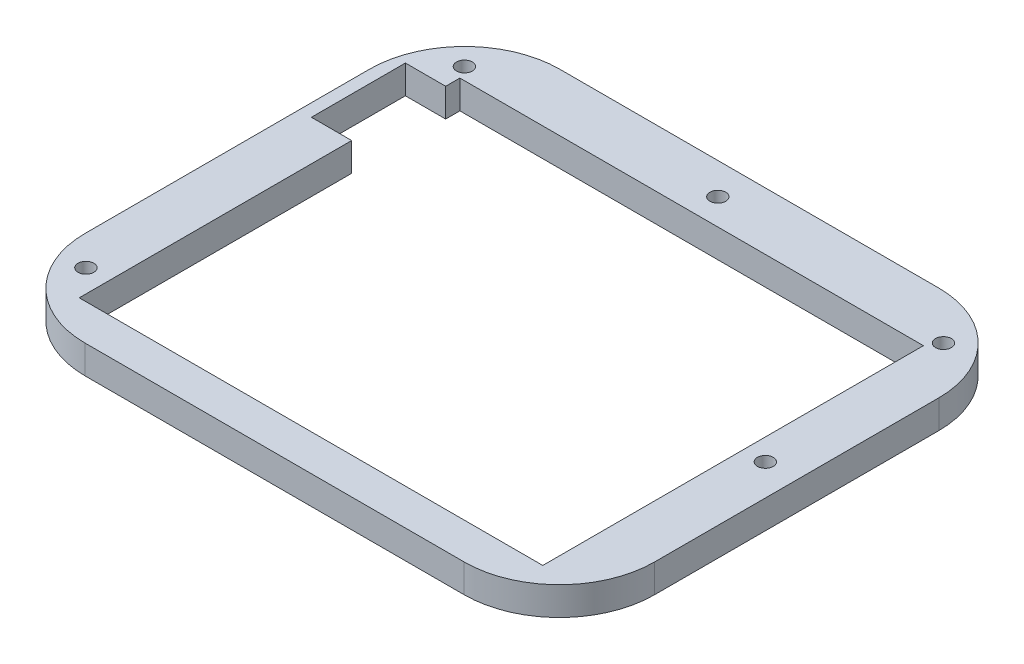
ISO-10303-21;
HEADER;
FILE_DESCRIPTION(('STEP AP214'),'2;1');
FILE_NAME('part.step','',(''),(''),'','','');
FILE_SCHEMA(('AUTOMOTIVE_DESIGN { 1 0 10303 214 1 1 1 1 }'));
ENDSEC;
DATA;
#1=APPLICATION_CONTEXT('core data for automotive mechanical design processes');
#2=APPLICATION_PROTOCOL_DEFINITION('international standard','automotive_design',2000,#1);
#3=PRODUCT_CONTEXT('',#1,'mechanical');
#4=PRODUCT('Part','Part','',(#3));
#5=PRODUCT_RELATED_PRODUCT_CATEGORY('part','',(#4));
#6=PRODUCT_DEFINITION_FORMATION('','',#4);
#7=PRODUCT_DEFINITION_CONTEXT('part definition',#1,'design');
#8=PRODUCT_DEFINITION('design','',#6,#7);
#9=PRODUCT_DEFINITION_SHAPE('','',#8);
#10=(LENGTH_UNIT() NAMED_UNIT(*) SI_UNIT(.MILLI.,.METRE.));
#11=(NAMED_UNIT(*) PLANE_ANGLE_UNIT() SI_UNIT($,.RADIAN.));
#12=(NAMED_UNIT(*) SI_UNIT($,.STERADIAN.) SOLID_ANGLE_UNIT());
#13=UNCERTAINTY_MEASURE_WITH_UNIT(LENGTH_MEASURE(1.E-05),#10,'distance_accuracy_value','');
#14=(GEOMETRIC_REPRESENTATION_CONTEXT(3) GLOBAL_UNCERTAINTY_ASSIGNED_CONTEXT((#13)) GLOBAL_UNIT_ASSIGNED_CONTEXT((#10,
#11,#12)) REPRESENTATION_CONTEXT('',''));
#15=CARTESIAN_POINT('',(0.,0.,0.));
#16=DIRECTION('',(0.,0.,1.));
#17=DIRECTION('',(1.,0.,0.));
#18=AXIS2_PLACEMENT_3D('',#15,#16,#17);
#19=CARTESIAN_POINT('',(-48.92,0.,-38.));
#20=DIRECTION('',(-1.,0.,0.));
#21=DIRECTION('',(0.,0.,1.));
#22=AXIS2_PLACEMENT_3D('',#19,#20,#21);
#23=PLANE('',#22);
#24=DIRECTION('',(0.,0.,1.));
#25=VECTOR('',#24,1.);
#26=CARTESIAN_POINT('',(-48.92,0.,-30.));
#27=LINE('',#26,#25);
#28=CARTESIAN_POINT('',(-48.92,0.,-15.08));
#29=VERTEX_POINT('',#28);
#30=CARTESIAN_POINT('',(-48.92,0.,42.42));
#31=VERTEX_POINT('',#30);
#32=EDGE_CURVE('E143',#29,#31,#27,.T.);
#33=ORIENTED_EDGE('',*,*,#32,.F.);
#34=DIRECTION('',(0.,1.,0.));
#35=VECTOR('',#34,1.);
#36=CARTESIAN_POINT('',(-48.92,0.,-15.08));
#37=LINE('',#36,#35);
#38=CARTESIAN_POINT('',(-48.92,6.,-15.08));
#39=VERTEX_POINT('',#38);
#40=EDGE_CURVE('E166',#29,#39,#37,.T.);
#41=ORIENTED_EDGE('',*,*,#40,.T.);
#42=DIRECTION('',(0.,0.,1.));
#43=VECTOR('',#42,1.);
#44=CARTESIAN_POINT('',(-48.92,6.,-30.));
#45=LINE('',#44,#43);
#46=CARTESIAN_POINT('',(-48.92,6.,42.42));
#47=VERTEX_POINT('',#46);
#48=EDGE_CURVE('E257',#39,#47,#45,.T.);
#49=ORIENTED_EDGE('',*,*,#48,.T.);
#50=DIRECTION('',(0.,1.,0.));
#51=VECTOR('',#50,1.);
#52=CARTESIAN_POINT('',(-48.92,0.,42.42));
#53=LINE('',#52,#51);
#54=EDGE_CURVE('E184',#31,#47,#53,.T.);
#55=ORIENTED_EDGE('',*,*,#54,.F.);
#56=EDGE_LOOP('',(#33,#41,#49,#55));
#57=FACE_BOUND('',#56,.T.);
#58=ADVANCED_FACE('F33',(#57),#23,.F.);
#59=CARTESIAN_POINT('',(-40.,6.,-30.));
#60=DIRECTION('',(0.,-1.,0.));
#61=DIRECTION('',(0.,0.,-1.));
#62=AXIS2_PLACEMENT_3D('',#59,#60,#61);
#63=CYLINDRICAL_SURFACE('',#62,20.08);
#64=CARTESIAN_POINT('',(-40.,0.,-30.));
#65=DIRECTION('',(0.,1.,0.));
#66=DIRECTION('',(0.,0.,1.));
#67=AXIS2_PLACEMENT_3D('',#64,#65,#66);
#68=CIRCLE('',#67,20.08);
#69=CARTESIAN_POINT('',(-40.,0.,-50.08));
#70=VERTEX_POINT('',#69);
#71=CARTESIAN_POINT('',(-60.08,0.,-30.));
#72=VERTEX_POINT('',#71);
#73=EDGE_CURVE('E223',#70,#72,#68,.T.);
#74=ORIENTED_EDGE('',*,*,#73,.T.);
#75=DIRECTION('',(0.,1.,0.));
#76=VECTOR('',#75,1.);
#77=CARTESIAN_POINT('',(-60.08,6.,-30.));
#78=LINE('',#77,#76);
#79=CARTESIAN_POINT('',(-60.08,6.,-30.));
#80=VERTEX_POINT('',#79);
#81=EDGE_CURVE('E12',#80,#72,#78,.F.);
#82=ORIENTED_EDGE('',*,*,#81,.F.);
#83=CARTESIAN_POINT('',(-40.,6.,-30.));
#84=DIRECTION('',(0.,1.,0.));
#85=DIRECTION('',(0.,0.,1.));
#86=AXIS2_PLACEMENT_3D('',#83,#84,#85);
#87=CIRCLE('',#86,20.08);
#88=CARTESIAN_POINT('',(-40.,6.,-50.08));
#89=VERTEX_POINT('',#88);
#90=EDGE_CURVE('E229',#89,#80,#87,.T.);
#91=ORIENTED_EDGE('',*,*,#90,.F.);
#92=DIRECTION('',(0.,-1.,0.));
#93=VECTOR('',#92,1.);
#94=CARTESIAN_POINT('',(-40.,6.,-50.08));
#95=LINE('',#94,#93);
#96=EDGE_CURVE('E203',#89,#70,#95,.T.);
#97=ORIENTED_EDGE('',*,*,#96,.T.);
#98=EDGE_LOOP('',(#74,#82,#91,#97));
#99=FACE_BOUND('',#98,.T.);
#100=ADVANCED_FACE('F303',(#99),#63,.T.);
#101=CARTESIAN_POINT('',(-60.08,6.,-30.));
#102=DIRECTION('',(1.,0.,0.));
#103=DIRECTION('',(0.,0.,-1.));
#104=AXIS2_PLACEMENT_3D('',#101,#102,#103);
#105=PLANE('',#104);
#106=DIRECTION('',(0.,0.,1.));
#107=VECTOR('',#106,1.);
#108=CARTESIAN_POINT('',(-60.08,0.,-30.));
#109=LINE('',#108,#107);
#110=CARTESIAN_POINT('',(-60.08,0.,30.));
#111=VERTEX_POINT('',#110);
#112=EDGE_CURVE('E226',#72,#111,#109,.T.);
#113=ORIENTED_EDGE('',*,*,#112,.T.);
#114=DIRECTION('',(0.,-1.,0.));
#115=VECTOR('',#114,1.);
#116=CARTESIAN_POINT('',(-60.08,6.,30.));
#117=LINE('',#116,#115);
#118=CARTESIAN_POINT('',(-60.08,6.,30.));
#119=VERTEX_POINT('',#118);
#120=EDGE_CURVE('E43',#119,#111,#117,.T.);
#121=ORIENTED_EDGE('',*,*,#120,.F.);
#122=DIRECTION('',(0.,0.,1.));
#123=VECTOR('',#122,1.);
#124=CARTESIAN_POINT('',(-60.08,6.,-30.));
#125=LINE('',#124,#123);
#126=EDGE_CURVE('E242',#80,#119,#125,.T.);
#127=ORIENTED_EDGE('',*,*,#126,.F.);
#128=ORIENTED_EDGE('',*,*,#81,.T.);
#129=EDGE_LOOP('',(#113,#121,#127,#128));
#130=FACE_BOUND('',#129,.T.);
#131=ADVANCED_FACE('F306',(#130),#105,.F.);
#132=CARTESIAN_POINT('',(-40.,6.,30.));
#133=DIRECTION('',(0.,-1.,0.));
#134=DIRECTION('',(0.,0.,-1.));
#135=AXIS2_PLACEMENT_3D('',#132,#133,#134);
#136=CYLINDRICAL_SURFACE('',#135,20.08);
#137=CARTESIAN_POINT('',(-40.,0.,30.));
#138=DIRECTION('',(0.,1.,0.));
#139=DIRECTION('',(0.,0.,1.));
#140=AXIS2_PLACEMENT_3D('',#137,#138,#139);
#141=CIRCLE('',#140,20.08);
#142=CARTESIAN_POINT('',(-40.,0.,50.08));
#143=VERTEX_POINT('',#142);
#144=EDGE_CURVE('E238',#111,#143,#141,.T.);
#145=ORIENTED_EDGE('',*,*,#144,.T.);
#146=DIRECTION('',(0.,1.,0.));
#147=VECTOR('',#146,1.);
#148=CARTESIAN_POINT('',(-40.,6.,50.08));
#149=LINE('',#148,#147);
#150=CARTESIAN_POINT('',(-40.,6.,50.08));
#151=VERTEX_POINT('',#150);
#152=EDGE_CURVE('E209',#151,#143,#149,.F.);
#153=ORIENTED_EDGE('',*,*,#152,.F.);
#154=CARTESIAN_POINT('',(-40.,6.,30.));
#155=DIRECTION('',(0.,1.,0.));
#156=DIRECTION('',(0.,0.,1.));
#157=AXIS2_PLACEMENT_3D('',#154,#155,#156);
#158=CIRCLE('',#157,20.08);
#159=EDGE_CURVE('E244',#119,#151,#158,.T.);
#160=ORIENTED_EDGE('',*,*,#159,.F.);
#161=ORIENTED_EDGE('',*,*,#120,.T.);
#162=EDGE_LOOP('',(#145,#153,#160,#161));
#163=FACE_BOUND('',#162,.T.);
#164=ADVANCED_FACE('F311',(#163),#136,.T.);
#165=CARTESIAN_POINT('',(-40.,6.,50.08));
#166=DIRECTION('',(0.,0.,-1.));
#167=DIRECTION('',(-1.,0.,0.));
#168=AXIS2_PLACEMENT_3D('',#165,#166,#167);
#169=PLANE('',#168);
#170=DIRECTION('',(1.,0.,0.));
#171=VECTOR('',#170,1.);
#172=CARTESIAN_POINT('',(-40.,0.,50.08));
#173=LINE('',#172,#171);
#174=CARTESIAN_POINT('',(40.,0.,50.08));
#175=VERTEX_POINT('',#174);
#176=EDGE_CURVE('E236',#143,#175,#173,.T.);
#177=ORIENTED_EDGE('',*,*,#176,.T.);
#178=DIRECTION('',(0.,-1.,0.));
#179=VECTOR('',#178,1.);
#180=CARTESIAN_POINT('',(40.,6.,50.08));
#181=LINE('',#180,#179);
#182=CARTESIAN_POINT('',(40.,6.,50.08));
#183=VERTEX_POINT('',#182);
#184=EDGE_CURVE('E212',#183,#175,#181,.T.);
#185=ORIENTED_EDGE('',*,*,#184,.F.);
#186=DIRECTION('',(1.,0.,0.));
#187=VECTOR('',#186,1.);
#188=CARTESIAN_POINT('',(-40.,6.,50.08));
#189=LINE('',#188,#187);
#190=EDGE_CURVE('E246',#151,#183,#189,.T.);
#191=ORIENTED_EDGE('',*,*,#190,.F.);
#192=ORIENTED_EDGE('',*,*,#152,.T.);
#193=EDGE_LOOP('',(#177,#185,#191,#192));
#194=FACE_BOUND('',#193,.T.);
#195=ADVANCED_FACE('F317',(#194),#169,.F.);
#196=CARTESIAN_POINT('',(40.,6.,30.));
#197=DIRECTION('',(0.,-1.,0.));
#198=DIRECTION('',(0.,0.,-1.));
#199=AXIS2_PLACEMENT_3D('',#196,#197,#198);
#200=CYLINDRICAL_SURFACE('',#199,20.08);
#201=CARTESIAN_POINT('',(40.,0.,30.));
#202=DIRECTION('',(0.,1.,0.));
#203=DIRECTION('',(0.,0.,1.));
#204=AXIS2_PLACEMENT_3D('',#201,#202,#203);
#205=CIRCLE('',#204,20.08);
#206=CARTESIAN_POINT('',(60.08,0.,30.));
#207=VERTEX_POINT('',#206);
#208=EDGE_CURVE('E234',#175,#207,#205,.T.);
#209=ORIENTED_EDGE('',*,*,#208,.T.);
#210=DIRECTION('',(0.,1.,0.));
#211=VECTOR('',#210,1.);
#212=CARTESIAN_POINT('',(60.08,6.,30.));
#213=LINE('',#212,#211);
#214=CARTESIAN_POINT('',(60.08,6.,30.));
#215=VERTEX_POINT('',#214);
#216=EDGE_CURVE('E215',#215,#207,#213,.F.);
#217=ORIENTED_EDGE('',*,*,#216,.F.);
#218=CARTESIAN_POINT('',(40.,6.,30.));
#219=DIRECTION('',(0.,1.,0.));
#220=DIRECTION('',(0.,0.,1.));
#221=AXIS2_PLACEMENT_3D('',#218,#219,#220);
#222=CIRCLE('',#221,20.08);
#223=EDGE_CURVE('E248',#183,#215,#222,.T.);
#224=ORIENTED_EDGE('',*,*,#223,.F.);
#225=ORIENTED_EDGE('',*,*,#184,.T.);
#226=EDGE_LOOP('',(#209,#217,#224,#225));
#227=FACE_BOUND('',#226,.T.);
#228=ADVANCED_FACE('F321',(#227),#200,.T.);
#229=CARTESIAN_POINT('',(60.08,6.,-30.));
#230=DIRECTION('',(-1.,0.,0.));
#231=DIRECTION('',(0.,0.,1.));
#232=AXIS2_PLACEMENT_3D('',#229,#230,#231);
#233=PLANE('',#232);
#234=DIRECTION('',(0.,0.,-1.));
#235=VECTOR('',#234,1.);
#236=CARTESIAN_POINT('',(60.08,0.,-30.));
#237=LINE('',#236,#235);
#238=CARTESIAN_POINT('',(60.08,0.,-30.));
#239=VERTEX_POINT('',#238);
#240=EDGE_CURVE('E232',#207,#239,#237,.T.);
#241=ORIENTED_EDGE('',*,*,#240,.T.);
#242=DIRECTION('',(0.,-1.,0.));
#243=VECTOR('',#242,1.);
#244=CARTESIAN_POINT('',(60.08,6.,-30.));
#245=LINE('',#244,#243);
#246=CARTESIAN_POINT('',(60.08,6.,-30.));
#247=VERTEX_POINT('',#246);
#248=EDGE_CURVE('E218',#247,#239,#245,.T.);
#249=ORIENTED_EDGE('',*,*,#248,.F.);
#250=DIRECTION('',(0.,0.,-1.));
#251=VECTOR('',#250,1.);
#252=CARTESIAN_POINT('',(60.08,6.,-30.));
#253=LINE('',#252,#251);
#254=EDGE_CURVE('E250',#215,#247,#253,.T.);
#255=ORIENTED_EDGE('',*,*,#254,.F.);
#256=ORIENTED_EDGE('',*,*,#216,.T.);
#257=EDGE_LOOP('',(#241,#249,#255,#256));
#258=FACE_BOUND('',#257,.T.);
#259=ADVANCED_FACE('F326',(#258),#233,.F.);
#260=CARTESIAN_POINT('',(40.,6.,-30.));
#261=DIRECTION('',(0.,-1.,0.));
#262=DIRECTION('',(0.,0.,-1.));
#263=AXIS2_PLACEMENT_3D('',#260,#261,#262);
#264=CYLINDRICAL_SURFACE('',#263,20.08);
#265=CARTESIAN_POINT('',(40.,0.,-30.));
#266=DIRECTION('',(0.,1.,0.));
#267=DIRECTION('',(0.,0.,1.));
#268=AXIS2_PLACEMENT_3D('',#265,#266,#267);
#269=CIRCLE('',#268,20.08);
#270=CARTESIAN_POINT('',(40.,0.,-50.08));
#271=VERTEX_POINT('',#270);
#272=EDGE_CURVE('E230',#239,#271,#269,.T.);
#273=ORIENTED_EDGE('',*,*,#272,.T.);
#274=DIRECTION('',(0.,1.,0.));
#275=VECTOR('',#274,1.);
#276=CARTESIAN_POINT('',(40.,6.,-50.08));
#277=LINE('',#276,#275);
#278=CARTESIAN_POINT('',(40.,6.,-50.08));
#279=VERTEX_POINT('',#278);
#280=EDGE_CURVE('E206',#279,#271,#277,.F.);
#281=ORIENTED_EDGE('',*,*,#280,.F.);
#282=CARTESIAN_POINT('',(40.,6.,-30.));
#283=DIRECTION('',(0.,1.,0.));
#284=DIRECTION('',(0.,0.,1.));
#285=AXIS2_PLACEMENT_3D('',#282,#283,#284);
#286=CIRCLE('',#285,20.08);
#287=EDGE_CURVE('E114',#247,#279,#286,.T.);
#288=ORIENTED_EDGE('',*,*,#287,.F.);
#289=ORIENTED_EDGE('',*,*,#248,.T.);
#290=EDGE_LOOP('',(#273,#281,#288,#289));
#291=FACE_BOUND('',#290,.T.);
#292=ADVANCED_FACE('F329',(#291),#264,.T.);
#293=CARTESIAN_POINT('',(-40.,6.,-50.08));
#294=DIRECTION('',(0.,0.,1.));
#295=DIRECTION('',(1.,0.,0.));
#296=AXIS2_PLACEMENT_3D('',#293,#294,#295);
#297=PLANE('',#296);
#298=DIRECTION('',(-1.,0.,0.));
#299=VECTOR('',#298,1.);
#300=CARTESIAN_POINT('',(-40.,0.,-50.08));
#301=LINE('',#300,#299);
#302=EDGE_CURVE('E227',#271,#70,#301,.T.);
#303=ORIENTED_EDGE('',*,*,#302,.T.);
#304=ORIENTED_EDGE('',*,*,#96,.F.);
#305=DIRECTION('',(-1.,0.,0.));
#306=VECTOR('',#305,1.);
#307=CARTESIAN_POINT('',(-40.,6.,-50.08));
#308=LINE('',#307,#306);
#309=EDGE_CURVE('E118',#279,#89,#308,.T.);
#310=ORIENTED_EDGE('',*,*,#309,.F.);
#311=ORIENTED_EDGE('',*,*,#280,.T.);
#312=EDGE_LOOP('',(#303,#304,#310,#311));
#313=FACE_BOUND('',#312,.T.);
#314=ADVANCED_FACE('F35',(#313),#297,.F.);
#315=CARTESIAN_POINT('',(-40.,6.,-30.));
#316=DIRECTION('',(0.,1.,0.));
#317=DIRECTION('',(0.,0.,1.));
#318=AXIS2_PLACEMENT_3D('',#315,#316,#317);
#319=PLANE('',#318);
#320=DIRECTION('',(1.,0.,0.));
#321=VECTOR('',#320,1.);
#322=CARTESIAN_POINT('',(-40.,6.,-15.08));
#323=LINE('',#322,#321);
#324=CARTESIAN_POINT('',(-57.42,6.,-15.08));
#325=VERTEX_POINT('',#324);
#326=EDGE_CURVE('E172',#325,#39,#323,.T.);
#327=ORIENTED_EDGE('',*,*,#326,.F.);
#328=DIRECTION('',(0.,0.,1.));
#329=VECTOR('',#328,1.);
#330=CARTESIAN_POINT('',(-57.42,6.,-30.));
#331=LINE('',#330,#329);
#332=CARTESIAN_POINT('',(-57.42,6.,-34.92));
#333=VERTEX_POINT('',#332);
#334=EDGE_CURVE('E493',#333,#325,#331,.T.);
#335=ORIENTED_EDGE('',*,*,#334,.F.);
#336=DIRECTION('',(-1.,0.,0.));
#337=VECTOR('',#336,1.);
#338=CARTESIAN_POINT('',(-40.,6.,-34.92));
#339=LINE('',#338,#337);
#340=CARTESIAN_POINT('',(-48.92,6.,-34.92));
#341=VERTEX_POINT('',#340);
#342=EDGE_CURVE('E488',#341,#333,#339,.T.);
#343=ORIENTED_EDGE('',*,*,#342,.F.);
#344=DIRECTION('',(0.,0.,1.));
#345=VECTOR('',#344,1.);
#346=CARTESIAN_POINT('',(-48.92,6.,-30.));
#347=LINE('',#346,#345);
#348=CARTESIAN_POINT('',(-48.92,6.,-37.92));
#349=VERTEX_POINT('',#348);
#350=EDGE_CURVE('E500',#349,#341,#347,.T.);
#351=ORIENTED_EDGE('',*,*,#350,.F.);
#352=DIRECTION('',(-1.,0.,0.));
#353=VECTOR('',#352,1.);
#354=CARTESIAN_POINT('',(-40.,6.,-37.92));
#355=LINE('',#354,#353);
#356=CARTESIAN_POINT('',(48.92,6.,-37.92));
#357=VERTEX_POINT('',#356);
#358=EDGE_CURVE('E187',#357,#349,#355,.T.);
#359=ORIENTED_EDGE('',*,*,#358,.F.);
#360=DIRECTION('',(0.,0.,-1.));
#361=VECTOR('',#360,1.);
#362=CARTESIAN_POINT('',(48.92,6.,-30.));
#363=LINE('',#362,#361);
#364=CARTESIAN_POINT('',(48.92,6.,42.42));
#365=VERTEX_POINT('',#364);
#366=EDGE_CURVE('E192',#365,#357,#363,.T.);
#367=ORIENTED_EDGE('',*,*,#366,.F.);
#368=DIRECTION('',(1.,0.,0.));
#369=VECTOR('',#368,1.);
#370=CARTESIAN_POINT('',(-40.,6.,42.42));
#371=LINE('',#370,#369);
#372=EDGE_CURVE('E501',#47,#365,#371,.T.);
#373=ORIENTED_EDGE('',*,*,#372,.F.);
#374=ORIENTED_EDGE('',*,*,#48,.F.);
#375=EDGE_LOOP('',(#327,#335,#343,#351,#359,#367,#373,#374));
#376=FACE_BOUND('',#375,.T.);
#377=CARTESIAN_POINT('',(-53.7092926056019,6.,36.2273752960605));
#378=DIRECTION('',(0.,1.,0.));
#379=DIRECTION('',(0.,0.,1.));
#380=AXIS2_PLACEMENT_3D('',#377,#378,#379);
#381=CIRCLE('',#380,1.67000000000001);
#382=CARTESIAN_POINT('',(-53.7092926056019,6.,37.8973752960605));
#383=VERTEX_POINT('',#382);
#384=EDGE_CURVE('E37',#383,#383,#381,.T.);
#385=ORIENTED_EDGE('',*,*,#384,.F.);
#386=EDGE_LOOP('',(#385));
#387=FACE_BOUND('',#386,.T.);
#388=CARTESIAN_POINT('',(-50.5585567633134,6.,-40.5085567633135));
#389=DIRECTION('',(0.,1.,0.));
#390=DIRECTION('',(0.,0.,1.));
#391=AXIS2_PLACEMENT_3D('',#388,#389,#390);
#392=CIRCLE('',#391,1.67000000000002);
#393=CARTESIAN_POINT('',(-50.5585567633134,6.,-38.8385567633135));
#394=VERTEX_POINT('',#393);
#395=EDGE_CURVE('E276',#394,#394,#392,.T.);
#396=ORIENTED_EDGE('',*,*,#395,.F.);
#397=EDGE_LOOP('',(#396));
#398=FACE_BOUND('',#397,.T.);
#399=CARTESIAN_POINT('',(50.5585567633134,6.,-40.5085567633134));
#400=DIRECTION('',(0.,1.,0.));
#401=DIRECTION('',(0.,0.,1.));
#402=AXIS2_PLACEMENT_3D('',#399,#400,#401);
#403=CIRCLE('',#402,1.67);
#404=CARTESIAN_POINT('',(50.5585567633134,6.,-38.8385567633134));
#405=VERTEX_POINT('',#404);
#406=EDGE_CURVE('E270',#405,#405,#403,.T.);
#407=ORIENTED_EDGE('',*,*,#406,.F.);
#408=EDGE_LOOP('',(#407));
#409=FACE_BOUND('',#408,.T.);
#410=CARTESIAN_POINT('',(0.,6.,-43.45));
#411=DIRECTION('',(0.,1.,0.));
#412=DIRECTION('',(0.,0.,1.));
#413=AXIS2_PLACEMENT_3D('',#410,#411,#412);
#414=CIRCLE('',#413,1.67);
#415=CARTESIAN_POINT('',(0.,6.,-41.78));
#416=VERTEX_POINT('',#415);
#417=EDGE_CURVE('E264',#416,#416,#414,.T.);
#418=ORIENTED_EDGE('',*,*,#417,.F.);
#419=EDGE_LOOP('',(#418));
#420=FACE_BOUND('',#419,.T.);
#421=CARTESIAN_POINT('',(53.475,6.,0.));
#422=DIRECTION('',(0.,1.,0.));
#423=DIRECTION('',(0.,0.,1.));
#424=AXIS2_PLACEMENT_3D('',#421,#422,#423);
#425=CIRCLE('',#424,1.67000000000001);
#426=CARTESIAN_POINT('',(53.475,6.,1.67000000000001));
#427=VERTEX_POINT('',#426);
#428=EDGE_CURVE('E258',#427,#427,#425,.T.);
#429=ORIENTED_EDGE('',*,*,#428,.F.);
#430=EDGE_LOOP('',(#429));
#431=FACE_BOUND('',#430,.T.);
#432=ORIENTED_EDGE('',*,*,#90,.T.);
#433=ORIENTED_EDGE('',*,*,#126,.T.);
#434=ORIENTED_EDGE('',*,*,#159,.T.);
#435=ORIENTED_EDGE('',*,*,#190,.T.);
#436=ORIENTED_EDGE('',*,*,#223,.T.);
#437=ORIENTED_EDGE('',*,*,#254,.T.);
#438=ORIENTED_EDGE('',*,*,#287,.T.);
#439=ORIENTED_EDGE('',*,*,#309,.T.);
#440=EDGE_LOOP('',(#432,#433,#434,#435,#436,#437,#438,#439));
#441=FACE_BOUND('',#440,.T.);
#442=ADVANCED_FACE('F287',(#376,#387,#398,#409,#420,#431,#441),#319,.T.);
#443=CARTESIAN_POINT('',(-40.,0.,-30.));
#444=DIRECTION('',(0.,1.,0.));
#445=DIRECTION('',(0.,0.,1.));
#446=AXIS2_PLACEMENT_3D('',#443,#444,#445);
#447=PLANE('',#446);
#448=CARTESIAN_POINT('',(-53.7092926056019,0.,36.2273752960605));
#449=DIRECTION('',(0.,1.,0.));
#450=DIRECTION('',(0.,0.,1.));
#451=AXIS2_PLACEMENT_3D('',#448,#449,#450);
#452=CIRCLE('',#451,1.67000000000001);
#453=CARTESIAN_POINT('',(-53.7092926056019,0.,37.8973752960605));
#454=VERTEX_POINT('',#453);
#455=EDGE_CURVE('E278',#454,#454,#452,.T.);
#456=ORIENTED_EDGE('',*,*,#455,.T.);
#457=EDGE_LOOP('',(#456));
#458=FACE_BOUND('',#457,.T.);
#459=CARTESIAN_POINT('',(-50.5585567633134,0.,-40.5085567633135));
#460=DIRECTION('',(0.,1.,0.));
#461=DIRECTION('',(0.,0.,1.));
#462=AXIS2_PLACEMENT_3D('',#459,#460,#461);
#463=CIRCLE('',#462,1.67000000000002);
#464=CARTESIAN_POINT('',(-50.5585567633134,0.,-38.8385567633135));
#465=VERTEX_POINT('',#464);
#466=EDGE_CURVE('E273',#465,#465,#463,.T.);
#467=ORIENTED_EDGE('',*,*,#466,.T.);
#468=EDGE_LOOP('',(#467));
#469=FACE_BOUND('',#468,.T.);
#470=CARTESIAN_POINT('',(50.5585567633134,0.,-40.5085567633134));
#471=DIRECTION('',(0.,1.,0.));
#472=DIRECTION('',(0.,0.,1.));
#473=AXIS2_PLACEMENT_3D('',#470,#471,#472);
#474=CIRCLE('',#473,1.67);
#475=CARTESIAN_POINT('',(50.5585567633134,0.,-38.8385567633134));
#476=VERTEX_POINT('',#475);
#477=EDGE_CURVE('E267',#476,#476,#474,.T.);
#478=ORIENTED_EDGE('',*,*,#477,.T.);
#479=EDGE_LOOP('',(#478));
#480=FACE_BOUND('',#479,.T.);
#481=CARTESIAN_POINT('',(0.,0.,-43.45));
#482=DIRECTION('',(0.,1.,0.));
#483=DIRECTION('',(0.,0.,1.));
#484=AXIS2_PLACEMENT_3D('',#481,#482,#483);
#485=CIRCLE('',#484,1.67);
#486=CARTESIAN_POINT('',(0.,0.,-41.78));
#487=VERTEX_POINT('',#486);
#488=EDGE_CURVE('E261',#487,#487,#485,.T.);
#489=ORIENTED_EDGE('',*,*,#488,.T.);
#490=EDGE_LOOP('',(#489));
#491=FACE_BOUND('',#490,.T.);
#492=CARTESIAN_POINT('',(53.475,0.,0.));
#493=DIRECTION('',(0.,1.,0.));
#494=DIRECTION('',(0.,0.,1.));
#495=AXIS2_PLACEMENT_3D('',#492,#493,#494);
#496=CIRCLE('',#495,1.67000000000001);
#497=CARTESIAN_POINT('',(53.475,0.,1.67000000000001));
#498=VERTEX_POINT('',#497);
#499=EDGE_CURVE('E254',#498,#498,#496,.T.);
#500=ORIENTED_EDGE('',*,*,#499,.T.);
#501=EDGE_LOOP('',(#500));
#502=FACE_BOUND('',#501,.T.);
#503=DIRECTION('',(0.,0.,1.));
#504=VECTOR('',#503,1.);
#505=CARTESIAN_POINT('',(-57.42,0.,-30.));
#506=LINE('',#505,#504);
#507=CARTESIAN_POINT('',(-57.42,0.,-34.92));
#508=VERTEX_POINT('',#507);
#509=CARTESIAN_POINT('',(-57.42,0.,-15.08));
#510=VERTEX_POINT('',#509);
#511=EDGE_CURVE('E180',#508,#510,#506,.T.);
#512=ORIENTED_EDGE('',*,*,#511,.T.);
#513=DIRECTION('',(1.,0.,0.));
#514=VECTOR('',#513,1.);
#515=CARTESIAN_POINT('',(-40.,0.,-15.08));
#516=LINE('',#515,#514);
#517=EDGE_CURVE('E169',#510,#29,#516,.T.);
#518=ORIENTED_EDGE('',*,*,#517,.T.);
#519=ORIENTED_EDGE('',*,*,#32,.T.);
#520=DIRECTION('',(1.,0.,0.));
#521=VECTOR('',#520,1.);
#522=CARTESIAN_POINT('',(-40.,0.,42.42));
#523=LINE('',#522,#521);
#524=CARTESIAN_POINT('',(48.92,0.,42.42));
#525=VERTEX_POINT('',#524);
#526=EDGE_CURVE('E190',#31,#525,#523,.T.);
#527=ORIENTED_EDGE('',*,*,#526,.T.);
#528=DIRECTION('',(0.,0.,-1.));
#529=VECTOR('',#528,1.);
#530=CARTESIAN_POINT('',(48.92,0.,-30.));
#531=LINE('',#530,#529);
#532=CARTESIAN_POINT('',(48.92,0.,-37.92));
#533=VERTEX_POINT('',#532);
#534=EDGE_CURVE('E126',#525,#533,#531,.T.);
#535=ORIENTED_EDGE('',*,*,#534,.T.);
#536=DIRECTION('',(-1.,0.,0.));
#537=VECTOR('',#536,1.);
#538=CARTESIAN_POINT('',(-40.,0.,-37.92));
#539=LINE('',#538,#537);
#540=CARTESIAN_POINT('',(-48.92,0.,-37.92));
#541=VERTEX_POINT('',#540);
#542=EDGE_CURVE('E198',#533,#541,#539,.T.);
#543=ORIENTED_EDGE('',*,*,#542,.T.);
#544=DIRECTION('',(0.,0.,1.));
#545=VECTOR('',#544,1.);
#546=CARTESIAN_POINT('',(-48.92,0.,-30.));
#547=LINE('',#546,#545);
#548=CARTESIAN_POINT('',(-48.92,0.,-34.92));
#549=VERTEX_POINT('',#548);
#550=EDGE_CURVE('E186',#541,#549,#547,.T.);
#551=ORIENTED_EDGE('',*,*,#550,.T.);
#552=DIRECTION('',(-1.,0.,0.));
#553=VECTOR('',#552,1.);
#554=CARTESIAN_POINT('',(-40.,0.,-34.92));
#555=LINE('',#554,#553);
#556=EDGE_CURVE('E52',#549,#508,#555,.T.);
#557=ORIENTED_EDGE('',*,*,#556,.T.);
#558=EDGE_LOOP('',(#512,#518,#519,#527,#535,#543,#551,#557));
#559=FACE_BOUND('',#558,.T.);
#560=ORIENTED_EDGE('',*,*,#73,.F.);
#561=ORIENTED_EDGE('',*,*,#302,.F.);
#562=ORIENTED_EDGE('',*,*,#272,.F.);
#563=ORIENTED_EDGE('',*,*,#240,.F.);
#564=ORIENTED_EDGE('',*,*,#208,.F.);
#565=ORIENTED_EDGE('',*,*,#176,.F.);
#566=ORIENTED_EDGE('',*,*,#144,.F.);
#567=ORIENTED_EDGE('',*,*,#112,.F.);
#568=EDGE_LOOP('',(#560,#561,#562,#563,#564,#565,#566,#567));
#569=FACE_BOUND('',#568,.T.);
#570=ADVANCED_FACE('F177',(#458,#469,#480,#491,#502,#559,#569),#447,.F.);
#571=ORIENTED_EDGE('',*,*,#350,.T.);
#572=DIRECTION('',(0.,1.,0.));
#573=VECTOR('',#572,1.);
#574=CARTESIAN_POINT('',(-48.92,0.,-34.92));
#575=LINE('',#574,#573);
#576=EDGE_CURVE('E181',#549,#341,#575,.T.);
#577=ORIENTED_EDGE('',*,*,#576,.F.);
#578=ORIENTED_EDGE('',*,*,#550,.F.);
#579=DIRECTION('',(0.,1.,0.));
#580=VECTOR('',#579,1.);
#581=CARTESIAN_POINT('',(-48.92,0.,-37.92));
#582=LINE('',#581,#580);
#583=EDGE_CURVE('E151',#541,#349,#582,.T.);
#584=ORIENTED_EDGE('',*,*,#583,.T.);
#585=EDGE_LOOP('',(#571,#577,#578,#584));
#586=FACE_BOUND('',#585,.T.);
#587=ADVANCED_FACE('F333',(#586),#23,.F.);
#588=CARTESIAN_POINT('',(-49.,0.,-37.92));
#589=DIRECTION('',(0.,0.,-1.));
#590=DIRECTION('',(-1.,0.,0.));
#591=AXIS2_PLACEMENT_3D('',#588,#589,#590);
#592=PLANE('',#591);
#593=ORIENTED_EDGE('',*,*,#358,.T.);
#594=ORIENTED_EDGE('',*,*,#583,.F.);
#595=ORIENTED_EDGE('',*,*,#542,.F.);
#596=DIRECTION('',(0.,1.,0.));
#597=VECTOR('',#596,1.);
#598=CARTESIAN_POINT('',(48.92,0.,-37.92));
#599=LINE('',#598,#597);
#600=EDGE_CURVE('E134',#533,#357,#599,.T.);
#601=ORIENTED_EDGE('',*,*,#600,.T.);
#602=EDGE_LOOP('',(#593,#594,#595,#601));
#603=FACE_BOUND('',#602,.T.);
#604=ADVANCED_FACE('F338',(#603),#592,.F.);
#605=CARTESIAN_POINT('',(48.92,0.,-38.));
#606=DIRECTION('',(1.,0.,0.));
#607=DIRECTION('',(0.,0.,-1.));
#608=AXIS2_PLACEMENT_3D('',#605,#606,#607);
#609=PLANE('',#608);
#610=ORIENTED_EDGE('',*,*,#366,.T.);
#611=ORIENTED_EDGE('',*,*,#600,.F.);
#612=ORIENTED_EDGE('',*,*,#534,.F.);
#613=DIRECTION('',(0.,1.,0.));
#614=VECTOR('',#613,1.);
#615=CARTESIAN_POINT('',(48.92,0.,42.42));
#616=LINE('',#615,#614);
#617=EDGE_CURVE('E507',#525,#365,#616,.T.);
#618=ORIENTED_EDGE('',*,*,#617,.T.);
#619=EDGE_LOOP('',(#610,#611,#612,#618));
#620=FACE_BOUND('',#619,.T.);
#621=ADVANCED_FACE('F353',(#620),#609,.F.);
#622=CARTESIAN_POINT('',(-49.,0.,42.42));
#623=DIRECTION('',(0.,0.,1.));
#624=DIRECTION('',(1.,0.,0.));
#625=AXIS2_PLACEMENT_3D('',#622,#623,#624);
#626=PLANE('',#625);
#627=ORIENTED_EDGE('',*,*,#372,.T.);
#628=ORIENTED_EDGE('',*,*,#617,.F.);
#629=ORIENTED_EDGE('',*,*,#526,.F.);
#630=ORIENTED_EDGE('',*,*,#54,.T.);
#631=EDGE_LOOP('',(#627,#628,#629,#630));
#632=FACE_BOUND('',#631,.T.);
#633=ADVANCED_FACE('F357',(#632),#626,.F.);
#634=CARTESIAN_POINT('',(53.475,0.,0.));
#635=DIRECTION('',(0.,1.,0.));
#636=DIRECTION('',(0.,0.,1.));
#637=AXIS2_PLACEMENT_3D('',#634,#635,#636);
#638=CYLINDRICAL_SURFACE('',#637,1.67000000000001);
#639=ORIENTED_EDGE('',*,*,#499,.F.);
#640=EDGE_LOOP('',(#639));
#641=FACE_BOUND('',#640,.T.);
#642=ORIENTED_EDGE('',*,*,#428,.T.);
#643=EDGE_LOOP('',(#642));
#644=FACE_BOUND('',#643,.T.);
#645=ADVANCED_FACE('F360',(#641,#644),#638,.F.);
#646=CARTESIAN_POINT('',(0.,0.,-43.45));
#647=DIRECTION('',(0.,1.,0.));
#648=DIRECTION('',(0.,0.,1.));
#649=AXIS2_PLACEMENT_3D('',#646,#647,#648);
#650=CYLINDRICAL_SURFACE('',#649,1.67);
#651=ORIENTED_EDGE('',*,*,#488,.F.);
#652=EDGE_LOOP('',(#651));
#653=FACE_BOUND('',#652,.T.);
#654=ORIENTED_EDGE('',*,*,#417,.T.);
#655=EDGE_LOOP('',(#654));
#656=FACE_BOUND('',#655,.T.);
#657=ADVANCED_FACE('F372',(#653,#656),#650,.F.);
#658=CARTESIAN_POINT('',(50.5585567633134,0.,-40.5085567633134));
#659=DIRECTION('',(0.,1.,0.));
#660=DIRECTION('',(0.,0.,1.));
#661=AXIS2_PLACEMENT_3D('',#658,#659,#660);
#662=CYLINDRICAL_SURFACE('',#661,1.67);
#663=ORIENTED_EDGE('',*,*,#477,.F.);
#664=EDGE_LOOP('',(#663));
#665=FACE_BOUND('',#664,.T.);
#666=ORIENTED_EDGE('',*,*,#406,.T.);
#667=EDGE_LOOP('',(#666));
#668=FACE_BOUND('',#667,.T.);
#669=ADVANCED_FACE('F368',(#665,#668),#662,.F.);
#670=CARTESIAN_POINT('',(-50.5585567633134,0.,-40.5085567633135));
#671=DIRECTION('',(0.,1.,0.));
#672=DIRECTION('',(0.,0.,1.));
#673=AXIS2_PLACEMENT_3D('',#670,#671,#672);
#674=CYLINDRICAL_SURFACE('',#673,1.67000000000002);
#675=ORIENTED_EDGE('',*,*,#466,.F.);
#676=EDGE_LOOP('',(#675));
#677=FACE_BOUND('',#676,.T.);
#678=ORIENTED_EDGE('',*,*,#395,.T.);
#679=EDGE_LOOP('',(#678));
#680=FACE_BOUND('',#679,.T.);
#681=ADVANCED_FACE('F364',(#677,#680),#674,.F.);
#682=CARTESIAN_POINT('',(-53.7092926056019,0.,36.2273752960605));
#683=DIRECTION('',(0.,1.,0.));
#684=DIRECTION('',(0.,0.,1.));
#685=AXIS2_PLACEMENT_3D('',#682,#683,#684);
#686=CYLINDRICAL_SURFACE('',#685,1.67000000000001);
#687=ORIENTED_EDGE('',*,*,#455,.F.);
#688=EDGE_LOOP('',(#687));
#689=FACE_BOUND('',#688,.T.);
#690=ORIENTED_EDGE('',*,*,#384,.T.);
#691=EDGE_LOOP('',(#690));
#692=FACE_BOUND('',#691,.T.);
#693=ADVANCED_FACE('F285',(#689,#692),#686,.F.);
#694=CARTESIAN_POINT('',(-49.,0.,-15.08));
#695=DIRECTION('',(0.,0.,1.));
#696=DIRECTION('',(1.,0.,0.));
#697=AXIS2_PLACEMENT_3D('',#694,#695,#696);
#698=PLANE('',#697);
#699=ORIENTED_EDGE('',*,*,#326,.T.);
#700=ORIENTED_EDGE('',*,*,#40,.F.);
#701=ORIENTED_EDGE('',*,*,#517,.F.);
#702=DIRECTION('',(0.,1.,0.));
#703=VECTOR('',#702,1.);
#704=CARTESIAN_POINT('',(-57.42,0.,-15.08));
#705=LINE('',#704,#703);
#706=EDGE_CURVE('E175',#510,#325,#705,.T.);
#707=ORIENTED_EDGE('',*,*,#706,.T.);
#708=EDGE_LOOP('',(#699,#700,#701,#707));
#709=FACE_BOUND('',#708,.T.);
#710=ADVANCED_FACE('F167',(#709),#698,.F.);
#711=CARTESIAN_POINT('',(-57.42,0.,-35.));
#712=DIRECTION('',(-1.,0.,0.));
#713=DIRECTION('',(0.,0.,1.));
#714=AXIS2_PLACEMENT_3D('',#711,#712,#713);
#715=PLANE('',#714);
#716=ORIENTED_EDGE('',*,*,#334,.T.);
#717=ORIENTED_EDGE('',*,*,#706,.F.);
#718=ORIENTED_EDGE('',*,*,#511,.F.);
#719=DIRECTION('',(0.,1.,0.));
#720=VECTOR('',#719,1.);
#721=CARTESIAN_POINT('',(-57.42,0.,-34.92));
#722=LINE('',#721,#720);
#723=EDGE_CURVE('E491',#508,#333,#722,.T.);
#724=ORIENTED_EDGE('',*,*,#723,.T.);
#725=EDGE_LOOP('',(#716,#717,#718,#724));
#726=FACE_BOUND('',#725,.T.);
#727=ADVANCED_FACE('F467',(#726),#715,.F.);
#728=CARTESIAN_POINT('',(-49.,0.,-34.92));
#729=DIRECTION('',(0.,0.,-1.));
#730=DIRECTION('',(-1.,0.,0.));
#731=AXIS2_PLACEMENT_3D('',#728,#729,#730);
#732=PLANE('',#731);
#733=ORIENTED_EDGE('',*,*,#342,.T.);
#734=ORIENTED_EDGE('',*,*,#723,.F.);
#735=ORIENTED_EDGE('',*,*,#556,.F.);
#736=ORIENTED_EDGE('',*,*,#576,.T.);
#737=EDGE_LOOP('',(#733,#734,#735,#736));
#738=FACE_BOUND('',#737,.T.);
#739=ADVANCED_FACE('F349',(#738),#732,.F.);
#740=CLOSED_SHELL('',(#58,#100,#131,#164,#195,#228,#259,#292,#314,#442,#570,#587,#604,#621,#633,
#645,#657,#669,#681,#693,#710,#727,#739));
#741=MANIFOLD_SOLID_BREP('B2',#740);
#742=ADVANCED_BREP_SHAPE_REPRESENTATION('',(#18,#741),#14);
#743=SHAPE_DEFINITION_REPRESENTATION(#9,#742);
ENDSEC;
END-ISO-10303-21;
